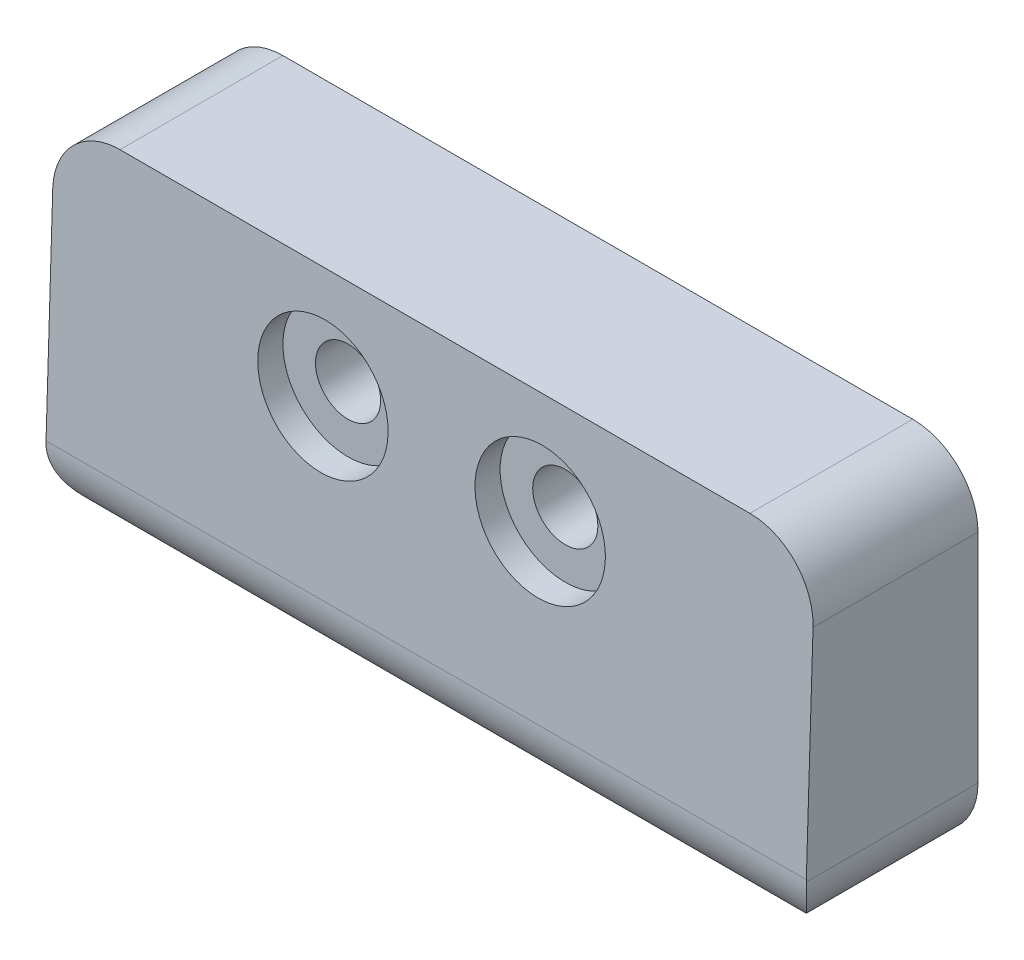
ISO-10303-21;
HEADER;
FILE_DESCRIPTION(('STEP AP214'),'2;1');
FILE_NAME('part.step','',(''),(''),'','','');
FILE_SCHEMA(('AUTOMOTIVE_DESIGN { 1 0 10303 214 1 1 1 1 }'));
ENDSEC;
DATA;
#1=APPLICATION_CONTEXT('core data for automotive mechanical design processes');
#2=APPLICATION_PROTOCOL_DEFINITION('international standard','automotive_design',2000,#1);
#3=PRODUCT_CONTEXT('',#1,'mechanical');
#4=PRODUCT('Part','Part','',(#3));
#5=PRODUCT_RELATED_PRODUCT_CATEGORY('part','',(#4));
#6=PRODUCT_DEFINITION_FORMATION('','',#4);
#7=PRODUCT_DEFINITION_CONTEXT('part definition',#1,'design');
#8=PRODUCT_DEFINITION('design','',#6,#7);
#9=PRODUCT_DEFINITION_SHAPE('','',#8);
#10=(LENGTH_UNIT() NAMED_UNIT(*) SI_UNIT(.MILLI.,.METRE.));
#11=(NAMED_UNIT(*) PLANE_ANGLE_UNIT() SI_UNIT($,.RADIAN.));
#12=(NAMED_UNIT(*) SI_UNIT($,.STERADIAN.) SOLID_ANGLE_UNIT());
#13=UNCERTAINTY_MEASURE_WITH_UNIT(LENGTH_MEASURE(1.E-05),#10,'distance_accuracy_value','');
#14=(GEOMETRIC_REPRESENTATION_CONTEXT(3) GLOBAL_UNCERTAINTY_ASSIGNED_CONTEXT((#13)) GLOBAL_UNIT_ASSIGNED_CONTEXT((#10,
#11,#12)) REPRESENTATION_CONTEXT('',''));
#15=CARTESIAN_POINT('',(0.,0.,0.));
#16=DIRECTION('',(0.,0.,1.));
#17=DIRECTION('',(1.,0.,0.));
#18=AXIS2_PLACEMENT_3D('',#15,#16,#17);
#19=CARTESIAN_POINT('',(-5.,0.,8.));
#20=DIRECTION('',(0.,0.,-1.));
#21=DIRECTION('',(-1.,0.,0.));
#22=AXIS2_PLACEMENT_3D('',#19,#20,#21);
#23=CYLINDRICAL_SURFACE('',#22,1.5);
#24=CARTESIAN_POINT('',(-5.,0.,0.));
#25=DIRECTION('',(0.,0.,1.));
#26=DIRECTION('',(1.,0.,0.));
#27=AXIS2_PLACEMENT_3D('',#24,#25,#26);
#28=CIRCLE('',#27,1.5);
#29=CARTESIAN_POINT('',(-3.49999999999999,0.,0.));
#30=VERTEX_POINT('',#29);
#31=EDGE_CURVE('E217',#30,#30,#28,.T.);
#32=ORIENTED_EDGE('',*,*,#31,.F.);
#33=EDGE_LOOP('',(#32));
#34=FACE_BOUND('',#33,.T.);
#35=CARTESIAN_POINT('',(-5.,0.,6.5));
#36=DIRECTION('',(0.,0.,1.));
#37=DIRECTION('',(1.,0.,0.));
#38=AXIS2_PLACEMENT_3D('',#35,#36,#37);
#39=CIRCLE('',#38,1.5);
#40=CARTESIAN_POINT('',(-3.49999999999999,0.,6.5));
#41=VERTEX_POINT('',#40);
#42=EDGE_CURVE('E230',#41,#41,#39,.T.);
#43=ORIENTED_EDGE('',*,*,#42,.T.);
#44=EDGE_LOOP('',(#43));
#45=FACE_BOUND('',#44,.T.);
#46=ADVANCED_FACE('F45',(#34,#45),#23,.F.);
#47=CARTESIAN_POINT('',(5.,0.,8.));
#48=DIRECTION('',(0.,0.,-1.));
#49=DIRECTION('',(-1.,0.,0.));
#50=AXIS2_PLACEMENT_3D('',#47,#48,#49);
#51=CYLINDRICAL_SURFACE('',#50,1.5);
#52=CARTESIAN_POINT('',(5.,0.,0.));
#53=DIRECTION('',(0.,0.,1.));
#54=DIRECTION('',(-1.,0.,0.));
#55=AXIS2_PLACEMENT_3D('',#52,#53,#54);
#56=CIRCLE('',#55,1.5);
#57=CARTESIAN_POINT('',(3.49999999999999,0.,0.));
#58=VERTEX_POINT('',#57);
#59=EDGE_CURVE('E221',#58,#58,#56,.T.);
#60=ORIENTED_EDGE('',*,*,#59,.F.);
#61=EDGE_LOOP('',(#60));
#62=FACE_BOUND('',#61,.T.);
#63=CARTESIAN_POINT('',(5.,0.,6.5));
#64=DIRECTION('',(0.,0.,1.));
#65=DIRECTION('',(1.,0.,0.));
#66=AXIS2_PLACEMENT_3D('',#63,#64,#65);
#67=CIRCLE('',#66,1.5);
#68=CARTESIAN_POINT('',(6.5,0.,6.5));
#69=VERTEX_POINT('',#68);
#70=EDGE_CURVE('E226',#69,#69,#67,.T.);
#71=ORIENTED_EDGE('',*,*,#70,.T.);
#72=EDGE_LOOP('',(#71));
#73=FACE_BOUND('',#72,.T.);
#74=ADVANCED_FACE('F285',(#62,#73),#51,.F.);
#75=CARTESIAN_POINT('',(0.,0.,0.));
#76=DIRECTION('',(0.,0.,1.));
#77=DIRECTION('',(1.,0.,0.));
#78=AXIS2_PLACEMENT_3D('',#75,#76,#77);
#79=PLANE('',#78);
#80=DIRECTION('',(-1.,0.,0.));
#81=VECTOR('',#80,1.);
#82=CARTESIAN_POINT('',(-17.5,5.,0.));
#83=LINE('',#82,#81);
#84=CARTESIAN_POINT('',(14.5,5.,0.));
#85=VERTEX_POINT('',#84);
#86=CARTESIAN_POINT('',(-14.5,5.,0.));
#87=VERTEX_POINT('',#86);
#88=EDGE_CURVE('E210',#85,#87,#83,.T.);
#89=ORIENTED_EDGE('',*,*,#88,.F.);
#90=CARTESIAN_POINT('',(14.5,2.,0.));
#91=DIRECTION('',(0.,0.,1.));
#92=DIRECTION('',(1.,0.,0.));
#93=AXIS2_PLACEMENT_3D('',#90,#91,#92);
#94=CIRCLE('',#93,3.);
#95=CARTESIAN_POINT('',(17.5,2.,0.));
#96=VERTEX_POINT('',#95);
#97=EDGE_CURVE('E11',#85,#96,#94,.F.);
#98=ORIENTED_EDGE('',*,*,#97,.T.);
#99=DIRECTION('',(0.,1.,0.));
#100=VECTOR('',#99,1.);
#101=CARTESIAN_POINT('',(17.5,5.,0.));
#102=LINE('',#101,#100);
#103=CARTESIAN_POINT('',(17.5,-8.,0.));
#104=VERTEX_POINT('',#103);
#105=EDGE_CURVE('E213',#104,#96,#102,.T.);
#106=ORIENTED_EDGE('',*,*,#105,.F.);
#107=CARTESIAN_POINT('',(14.5,-8.,0.));
#108=DIRECTION('',(0.,0.,1.));
#109=DIRECTION('',(1.,0.,0.));
#110=AXIS2_PLACEMENT_3D('',#107,#108,#109);
#111=CIRCLE('',#110,3.);
#112=CARTESIAN_POINT('',(14.5,-11.,0.));
#113=VERTEX_POINT('',#112);
#114=EDGE_CURVE('E55',#104,#113,#111,.F.);
#115=ORIENTED_EDGE('',*,*,#114,.T.);
#116=DIRECTION('',(-1.,0.,0.));
#117=VECTOR('',#116,1.);
#118=CARTESIAN_POINT('',(0.,-11.,0.));
#119=LINE('',#118,#117);
#120=CARTESIAN_POINT('',(-14.5,-11.,0.));
#121=VERTEX_POINT('',#120);
#122=EDGE_CURVE('E235',#113,#121,#119,.T.);
#123=ORIENTED_EDGE('',*,*,#122,.T.);
#124=CARTESIAN_POINT('',(-14.5,-8.,0.));
#125=DIRECTION('',(0.,0.,1.));
#126=DIRECTION('',(1.,0.,0.));
#127=AXIS2_PLACEMENT_3D('',#124,#125,#126);
#128=CIRCLE('',#127,3.);
#129=CARTESIAN_POINT('',(-17.5,-8.,0.));
#130=VERTEX_POINT('',#129);
#131=EDGE_CURVE('E167',#121,#130,#128,.F.);
#132=ORIENTED_EDGE('',*,*,#131,.T.);
#133=DIRECTION('',(0.,-1.,0.));
#134=VECTOR('',#133,1.);
#135=CARTESIAN_POINT('',(-17.5,5.,0.));
#136=LINE('',#135,#134);
#137=CARTESIAN_POINT('',(-17.5,2.,0.));
#138=VERTEX_POINT('',#137);
#139=EDGE_CURVE('E134',#138,#130,#136,.T.);
#140=ORIENTED_EDGE('',*,*,#139,.F.);
#141=CARTESIAN_POINT('',(-14.5,2.,0.));
#142=DIRECTION('',(0.,0.,1.));
#143=DIRECTION('',(1.,0.,0.));
#144=AXIS2_PLACEMENT_3D('',#141,#142,#143);
#145=CIRCLE('',#144,3.);
#146=EDGE_CURVE('E63',#138,#87,#145,.F.);
#147=ORIENTED_EDGE('',*,*,#146,.T.);
#148=EDGE_LOOP('',(#89,#98,#106,#115,#123,#132,#140,#147));
#149=FACE_BOUND('',#148,.T.);
#150=ORIENTED_EDGE('',*,*,#31,.T.);
#151=EDGE_LOOP('',(#150));
#152=FACE_BOUND('',#151,.T.);
#153=ORIENTED_EDGE('',*,*,#59,.T.);
#154=EDGE_LOOP('',(#153));
#155=FACE_BOUND('',#154,.T.);
#156=ADVANCED_FACE('F264',(#149,#152,#155),#79,.F.);
#157=CARTESIAN_POINT('',(17.5,5.,8.));
#158=DIRECTION('',(-1.,0.,0.));
#159=DIRECTION('',(0.,0.,1.));
#160=AXIS2_PLACEMENT_3D('',#157,#158,#159);
#161=PLANE('',#160);
#162=ORIENTED_EDGE('',*,*,#105,.T.);
#163=DIRECTION('',(0.,0.,-1.));
#164=VECTOR('',#163,1.);
#165=CARTESIAN_POINT('',(17.5,2.,8.));
#166=LINE('',#165,#164);
#167=CARTESIAN_POINT('',(17.5,2.,7.59375));
#168=VERTEX_POINT('',#167);
#169=EDGE_CURVE('E191',#96,#168,#166,.F.);
#170=ORIENTED_EDGE('',*,*,#169,.T.);
#171=DIRECTION('',(0.,-0.999512076087079,0.0312347523777212));
#172=VECTOR('',#171,1.);
#173=CARTESIAN_POINT('',(17.5,0.239024390243903,7.64878048780488));
#174=LINE('',#173,#172);
#175=CARTESIAN_POINT('',(17.5,-7.90629574286683,7.90332174196459));
#176=VERTEX_POINT('',#175);
#177=EDGE_CURVE('E144',#168,#176,#174,.T.);
#178=ORIENTED_EDGE('',*,*,#177,.T.);
#179=CARTESIAN_POINT('',(17.5,-8.,4.90478551370335));
#180=DIRECTION('',(-1.,0.,0.));
#181=DIRECTION('',(0.,0.,1.));
#182=AXIS2_PLACEMENT_3D('',#179,#180,#181);
#183=CIRCLE('',#182,3.);
#184=CARTESIAN_POINT('',(17.5,-8.,7.90478551370335));
#185=VERTEX_POINT('',#184);
#186=EDGE_CURVE('E195',#176,#185,#183,.F.);
#187=ORIENTED_EDGE('',*,*,#186,.T.);
#188=DIRECTION('',(0.,0.,1.));
#189=VECTOR('',#188,1.);
#190=CARTESIAN_POINT('',(17.5,-8.,0.));
#191=LINE('',#190,#189);
#192=EDGE_CURVE('E200',#185,#104,#191,.F.);
#193=ORIENTED_EDGE('',*,*,#192,.T.);
#194=EDGE_LOOP('',(#162,#170,#178,#187,#193));
#195=FACE_BOUND('',#194,.T.);
#196=ADVANCED_FACE('F258',(#195),#161,.F.);
#197=CARTESIAN_POINT('',(-17.5,5.,8.));
#198=DIRECTION('',(0.,-1.,0.));
#199=DIRECTION('',(0.,0.,-1.));
#200=AXIS2_PLACEMENT_3D('',#197,#198,#199);
#201=PLANE('',#200);
#202=DIRECTION('',(-1.,0.,0.));
#203=VECTOR('',#202,1.);
#204=CARTESIAN_POINT('',(17.5,5.,7.5));
#205=LINE('',#204,#203);
#206=CARTESIAN_POINT('',(14.5,5.,7.5));
#207=VERTEX_POINT('',#206);
#208=CARTESIAN_POINT('',(-14.5,5.,7.5));
#209=VERTEX_POINT('',#208);
#210=EDGE_CURVE('E128',#207,#209,#205,.T.);
#211=ORIENTED_EDGE('',*,*,#210,.F.);
#212=DIRECTION('',(0.,0.,-1.));
#213=VECTOR('',#212,1.);
#214=CARTESIAN_POINT('',(14.5,5.,8.));
#215=LINE('',#214,#213);
#216=EDGE_CURVE('E162',#207,#85,#215,.T.);
#217=ORIENTED_EDGE('',*,*,#216,.T.);
#218=ORIENTED_EDGE('',*,*,#88,.T.);
#219=DIRECTION('',(0.,0.,-1.));
#220=VECTOR('',#219,1.);
#221=CARTESIAN_POINT('',(-14.5,5.,8.));
#222=LINE('',#221,#220);
#223=EDGE_CURVE('E159',#87,#209,#222,.F.);
#224=ORIENTED_EDGE('',*,*,#223,.T.);
#225=EDGE_LOOP('',(#211,#217,#218,#224));
#226=FACE_BOUND('',#225,.T.);
#227=ADVANCED_FACE('F263',(#226),#201,.F.);
#228=CARTESIAN_POINT('',(-17.5,5.,8.));
#229=DIRECTION('',(1.,0.,0.));
#230=DIRECTION('',(0.,0.,-1.));
#231=AXIS2_PLACEMENT_3D('',#228,#229,#230);
#232=PLANE('',#231);
#233=DIRECTION('',(0.,0.,1.));
#234=VECTOR('',#233,1.);
#235=CARTESIAN_POINT('',(-17.5,-8.,8.));
#236=LINE('',#235,#234);
#237=CARTESIAN_POINT('',(-17.5,-8.,7.90478551370335));
#238=VERTEX_POINT('',#237);
#239=EDGE_CURVE('E147',#130,#238,#236,.T.);
#240=ORIENTED_EDGE('',*,*,#239,.T.);
#241=CARTESIAN_POINT('',(-17.5,-7.99999999999999,4.90478551370335));
#242=DIRECTION('',(1.,0.,0.));
#243=DIRECTION('',(0.,0.,-1.));
#244=AXIS2_PLACEMENT_3D('',#241,#242,#243);
#245=CIRCLE('',#244,3.);
#246=CARTESIAN_POINT('',(-17.5,-7.90629574286683,7.90332174196459));
#247=VERTEX_POINT('',#246);
#248=EDGE_CURVE('E142',#238,#247,#245,.F.);
#249=ORIENTED_EDGE('',*,*,#248,.T.);
#250=DIRECTION('',(0.,-0.999512076087079,0.0312347523777212));
#251=VECTOR('',#250,1.);
#252=CARTESIAN_POINT('',(-17.5,0.239024390243903,7.64878048780488));
#253=LINE('',#252,#251);
#254=CARTESIAN_POINT('',(-17.5,2.,7.59375));
#255=VERTEX_POINT('',#254);
#256=EDGE_CURVE('E125',#255,#247,#253,.T.);
#257=ORIENTED_EDGE('',*,*,#256,.F.);
#258=DIRECTION('',(0.,0.,-1.));
#259=VECTOR('',#258,1.);
#260=CARTESIAN_POINT('',(-17.5,2.,8.));
#261=LINE('',#260,#259);
#262=EDGE_CURVE('E140',#255,#138,#261,.T.);
#263=ORIENTED_EDGE('',*,*,#262,.T.);
#264=ORIENTED_EDGE('',*,*,#139,.T.);
#265=EDGE_LOOP('',(#240,#249,#257,#263,#264));
#266=FACE_BOUND('',#265,.T.);
#267=ADVANCED_FACE('F138',(#266),#232,.F.);
#268=CARTESIAN_POINT('',(5.,0.,6.5));
#269=DIRECTION('',(0.,0.,1.));
#270=DIRECTION('',(1.,0.,0.));
#271=AXIS2_PLACEMENT_3D('',#268,#269,#270);
#272=CYLINDRICAL_SURFACE('',#271,3.);
#273=CARTESIAN_POINT('',(5.,0.,7.65625));
#274=DIRECTION('',(0.,-0.0312347523777212,-0.999512076087079));
#275=DIRECTION('',(0.,-0.999512076087079,0.0312347523777212));
#276=AXIS2_PLACEMENT_3D('',#273,#274,#275);
#277=ELLIPSE('',#276,3.00146448629665,3.);
#278=CARTESIAN_POINT('',(5.,-3.,7.75));
#279=VERTEX_POINT('',#278);
#280=EDGE_CURVE('E244',#279,#279,#277,.F.);
#281=ORIENTED_EDGE('',*,*,#280,.T.);
#282=EDGE_LOOP('',(#281));
#283=FACE_BOUND('',#282,.T.);
#284=CARTESIAN_POINT('',(5.,0.,6.5));
#285=DIRECTION('',(0.,0.,1.));
#286=DIRECTION('',(1.,0.,0.));
#287=AXIS2_PLACEMENT_3D('',#284,#285,#286);
#288=CIRCLE('',#287,3.);
#289=CARTESIAN_POINT('',(8.,0.,6.5));
#290=VERTEX_POINT('',#289);
#291=EDGE_CURVE('E231',#290,#290,#288,.T.);
#292=ORIENTED_EDGE('',*,*,#291,.F.);
#293=EDGE_LOOP('',(#292));
#294=FACE_BOUND('',#293,.T.);
#295=ADVANCED_FACE('F301',(#283,#294),#272,.F.);
#296=CARTESIAN_POINT('',(5.,0.,6.5));
#297=DIRECTION('',(0.,0.,1.));
#298=DIRECTION('',(1.,0.,0.));
#299=AXIS2_PLACEMENT_3D('',#296,#297,#298);
#300=PLANE('',#299);
#301=ORIENTED_EDGE('',*,*,#70,.F.);
#302=EDGE_LOOP('',(#301));
#303=FACE_BOUND('',#302,.T.);
#304=ORIENTED_EDGE('',*,*,#291,.T.);
#305=EDGE_LOOP('',(#304));
#306=FACE_BOUND('',#305,.T.);
#307=ADVANCED_FACE('F395',(#303,#306),#300,.T.);
#308=CARTESIAN_POINT('',(-5.,0.,6.5));
#309=DIRECTION('',(0.,0.,1.));
#310=DIRECTION('',(1.,0.,0.));
#311=AXIS2_PLACEMENT_3D('',#308,#309,#310);
#312=CYLINDRICAL_SURFACE('',#311,3.);
#313=CARTESIAN_POINT('',(-5.,0.,7.65625));
#314=DIRECTION('',(0.,-0.0312347523777212,-0.999512076087079));
#315=DIRECTION('',(0.,-0.999512076087079,0.0312347523777212));
#316=AXIS2_PLACEMENT_3D('',#313,#314,#315);
#317=ELLIPSE('',#316,3.00146448629665,3.);
#318=CARTESIAN_POINT('',(-5.,-3.,7.75));
#319=VERTEX_POINT('',#318);
#320=EDGE_CURVE('E248',#319,#319,#317,.F.);
#321=ORIENTED_EDGE('',*,*,#320,.T.);
#322=EDGE_LOOP('',(#321));
#323=FACE_BOUND('',#322,.T.);
#324=CARTESIAN_POINT('',(-5.,0.,6.5));
#325=DIRECTION('',(0.,0.,1.));
#326=DIRECTION('',(1.,0.,0.));
#327=AXIS2_PLACEMENT_3D('',#324,#325,#326);
#328=CIRCLE('',#327,3.);
#329=CARTESIAN_POINT('',(-1.99999999999999,0.,6.5));
#330=VERTEX_POINT('',#329);
#331=EDGE_CURVE('E225',#330,#330,#328,.T.);
#332=ORIENTED_EDGE('',*,*,#331,.F.);
#333=EDGE_LOOP('',(#332));
#334=FACE_BOUND('',#333,.T.);
#335=ADVANCED_FACE('F281',(#323,#334),#312,.F.);
#336=CARTESIAN_POINT('',(-5.,0.,6.5));
#337=DIRECTION('',(0.,0.,1.));
#338=DIRECTION('',(1.,0.,0.));
#339=AXIS2_PLACEMENT_3D('',#336,#337,#338);
#340=PLANE('',#339);
#341=ORIENTED_EDGE('',*,*,#42,.F.);
#342=EDGE_LOOP('',(#341));
#343=FACE_BOUND('',#342,.T.);
#344=ORIENTED_EDGE('',*,*,#331,.T.);
#345=EDGE_LOOP('',(#344));
#346=FACE_BOUND('',#345,.T.);
#347=ADVANCED_FACE('F273',(#343,#346),#340,.T.);
#348=CARTESIAN_POINT('',(0.,-11.,-35.5105618091294));
#349=DIRECTION('',(0.,-1.,0.));
#350=DIRECTION('',(1.,0.,0.));
#351=AXIS2_PLACEMENT_3D('',#348,#349,#350);
#352=PLANE('',#351);
#353=ORIENTED_EDGE('',*,*,#122,.F.);
#354=DIRECTION('',(0.,0.,1.));
#355=VECTOR('',#354,1.);
#356=CARTESIAN_POINT('',(14.5,-11.,8.));
#357=LINE('',#356,#355);
#358=CARTESIAN_POINT('',(14.5,-11.,4.90478551370335));
#359=VERTEX_POINT('',#358);
#360=EDGE_CURVE('E148',#113,#359,#357,.T.);
#361=ORIENTED_EDGE('',*,*,#360,.T.);
#362=DIRECTION('',(1.,0.,0.));
#363=VECTOR('',#362,1.);
#364=CARTESIAN_POINT('',(-17.5,-11.,4.90478551370335));
#365=LINE('',#364,#363);
#366=CARTESIAN_POINT('',(-14.5,-11.,4.90478551370335));
#367=VERTEX_POINT('',#366);
#368=EDGE_CURVE('E153',#359,#367,#365,.F.);
#369=ORIENTED_EDGE('',*,*,#368,.T.);
#370=DIRECTION('',(0.,0.,1.));
#371=VECTOR('',#370,1.);
#372=CARTESIAN_POINT('',(-14.5,-11.,0.));
#373=LINE('',#372,#371);
#374=EDGE_CURVE('E186',#367,#121,#373,.F.);
#375=ORIENTED_EDGE('',*,*,#374,.T.);
#376=EDGE_LOOP('',(#353,#361,#369,#375));
#377=FACE_BOUND('',#376,.T.);
#378=ADVANCED_FACE('F271',(#377),#352,.T.);
#379=CARTESIAN_POINT('',(17.5,0.239024390243903,7.64878048780488));
#380=DIRECTION('',(0.,-0.0312347523777212,-0.999512076087079));
#381=DIRECTION('',(0.,0.999512076087079,-0.0312347523777212));
#382=AXIS2_PLACEMENT_3D('',#379,#380,#381);
#383=PLANE('',#382);
#384=ORIENTED_EDGE('',*,*,#320,.F.);
#385=EDGE_LOOP('',(#384));
#386=FACE_BOUND('',#385,.T.);
#387=ORIENTED_EDGE('',*,*,#256,.T.);
#388=DIRECTION('',(1.,0.,0.));
#389=VECTOR('',#388,1.);
#390=CARTESIAN_POINT('',(17.5,-7.90629574286683,7.90332174196459));
#391=LINE('',#390,#389);
#392=EDGE_CURVE('E203',#247,#176,#391,.T.);
#393=ORIENTED_EDGE('',*,*,#392,.T.);
#394=ORIENTED_EDGE('',*,*,#177,.F.);
#395=CARTESIAN_POINT('',(14.5,2.,7.59375));
#396=DIRECTION('',(0.,-0.0312347523777212,-0.999512076087079));
#397=DIRECTION('',(0.,0.999512076087079,-0.0312347523777212));
#398=AXIS2_PLACEMENT_3D('',#395,#396,#397);
#399=ELLIPSE('',#398,3.00146448629665,3.);
#400=EDGE_CURVE('E133',#168,#207,#399,.F.);
#401=ORIENTED_EDGE('',*,*,#400,.T.);
#402=ORIENTED_EDGE('',*,*,#210,.T.);
#403=CARTESIAN_POINT('',(-14.5,2.,7.59375));
#404=DIRECTION('',(0.,-0.0312347523777212,-0.999512076087079));
#405=DIRECTION('',(0.,0.999512076087079,-0.0312347523777212));
#406=AXIS2_PLACEMENT_3D('',#403,#404,#405);
#407=ELLIPSE('',#406,3.00146448629665,3.);
#408=EDGE_CURVE('E120',#209,#255,#407,.F.);
#409=ORIENTED_EDGE('',*,*,#408,.T.);
#410=EDGE_LOOP('',(#387,#393,#394,#401,#402,#409));
#411=FACE_BOUND('',#410,.T.);
#412=ORIENTED_EDGE('',*,*,#280,.F.);
#413=EDGE_LOOP('',(#412));
#414=FACE_BOUND('',#413,.T.);
#415=ADVANCED_FACE('F122',(#386,#411,#414),#383,.F.);
#416=CARTESIAN_POINT('',(-14.5,-8.,8.));
#417=DIRECTION('',(0.,0.,-1.));
#418=DIRECTION('',(-1.,0.,0.));
#419=AXIS2_PLACEMENT_3D('',#416,#417,#418);
#420=CYLINDRICAL_SURFACE('',#419,3.);
#421=ORIENTED_EDGE('',*,*,#131,.F.);
#422=ORIENTED_EDGE('',*,*,#374,.F.);
#423=CARTESIAN_POINT('',(-14.5,-8.,4.90478551370335));
#424=DIRECTION('',(-0.707106781186547,0.,-0.707106781186547));
#425=DIRECTION('',(0.707106781186547,0.,-0.707106781186547));
#426=AXIS2_PLACEMENT_3D('',#423,#424,#425);
#427=ELLIPSE('',#426,4.24264068711928,3.);
#428=EDGE_CURVE('E49',#238,#367,#427,.F.);
#429=ORIENTED_EDGE('',*,*,#428,.F.);
#430=ORIENTED_EDGE('',*,*,#239,.F.);
#431=EDGE_LOOP('',(#421,#422,#429,#430));
#432=FACE_BOUND('',#431,.T.);
#433=ADVANCED_FACE('F185',(#432),#420,.T.);
#434=CARTESIAN_POINT('',(14.5,-8.,-35.5105618091294));
#435=DIRECTION('',(0.,0.,-1.));
#436=DIRECTION('',(-1.,0.,0.));
#437=AXIS2_PLACEMENT_3D('',#434,#435,#436);
#438=CYLINDRICAL_SURFACE('',#437,3.);
#439=ORIENTED_EDGE('',*,*,#114,.F.);
#440=ORIENTED_EDGE('',*,*,#192,.F.);
#441=CARTESIAN_POINT('',(14.5,-8.,4.90478551370335));
#442=DIRECTION('',(0.707106781186547,0.,-0.707106781186547));
#443=DIRECTION('',(-0.707106781186547,0.,-0.707106781186547));
#444=AXIS2_PLACEMENT_3D('',#441,#442,#443);
#445=ELLIPSE('',#444,4.24264068711928,3.);
#446=EDGE_CURVE('E171',#359,#185,#445,.F.);
#447=ORIENTED_EDGE('',*,*,#446,.F.);
#448=ORIENTED_EDGE('',*,*,#360,.F.);
#449=EDGE_LOOP('',(#439,#440,#447,#448));
#450=FACE_BOUND('',#449,.T.);
#451=ADVANCED_FACE('F269',(#450),#438,.T.);
#452=CARTESIAN_POINT('',(17.5,-8.,4.90478551370335));
#453=DIRECTION('',(-1.,0.,0.));
#454=DIRECTION('',(0.,-1.,0.));
#455=AXIS2_PLACEMENT_3D('',#452,#453,#454);
#456=CYLINDRICAL_SURFACE('',#455,3.);
#457=ORIENTED_EDGE('',*,*,#428,.T.);
#458=ORIENTED_EDGE('',*,*,#368,.F.);
#459=ORIENTED_EDGE('',*,*,#446,.T.);
#460=ORIENTED_EDGE('',*,*,#186,.F.);
#461=ORIENTED_EDGE('',*,*,#392,.F.);
#462=ORIENTED_EDGE('',*,*,#248,.F.);
#463=EDGE_LOOP('',(#457,#458,#459,#460,#461,#462));
#464=FACE_BOUND('',#463,.T.);
#465=ADVANCED_FACE('F180',(#464),#456,.T.);
#466=CARTESIAN_POINT('',(14.5,2.,8.));
#467=DIRECTION('',(0.,0.,-1.));
#468=DIRECTION('',(-1.,0.,0.));
#469=AXIS2_PLACEMENT_3D('',#466,#467,#468);
#470=CYLINDRICAL_SURFACE('',#469,3.);
#471=ORIENTED_EDGE('',*,*,#400,.F.);
#472=ORIENTED_EDGE('',*,*,#169,.F.);
#473=ORIENTED_EDGE('',*,*,#97,.F.);
#474=ORIENTED_EDGE('',*,*,#216,.F.);
#475=EDGE_LOOP('',(#471,#472,#473,#474));
#476=FACE_BOUND('',#475,.T.);
#477=ADVANCED_FACE('F261',(#476),#470,.T.);
#478=CARTESIAN_POINT('',(-14.5,2.,8.));
#479=DIRECTION('',(0.,0.,-1.));
#480=DIRECTION('',(-1.,0.,0.));
#481=AXIS2_PLACEMENT_3D('',#478,#479,#480);
#482=CYLINDRICAL_SURFACE('',#481,3.);
#483=ORIENTED_EDGE('',*,*,#408,.F.);
#484=ORIENTED_EDGE('',*,*,#223,.F.);
#485=ORIENTED_EDGE('',*,*,#146,.F.);
#486=ORIENTED_EDGE('',*,*,#262,.F.);
#487=EDGE_LOOP('',(#483,#484,#485,#486));
#488=FACE_BOUND('',#487,.T.);
#489=ADVANCED_FACE('F47',(#488),#482,.T.);
#490=CLOSED_SHELL('',(#46,#74,#156,#196,#227,#267,#295,#307,#335,#347,#378,#415,#433,#451,#465,
#477,#489));
#491=MANIFOLD_SOLID_BREP('B2',#490);
#492=ADVANCED_BREP_SHAPE_REPRESENTATION('',(#18,#491),#14);
#493=SHAPE_DEFINITION_REPRESENTATION(#9,#492);
ENDSEC;
END-ISO-10303-21;
